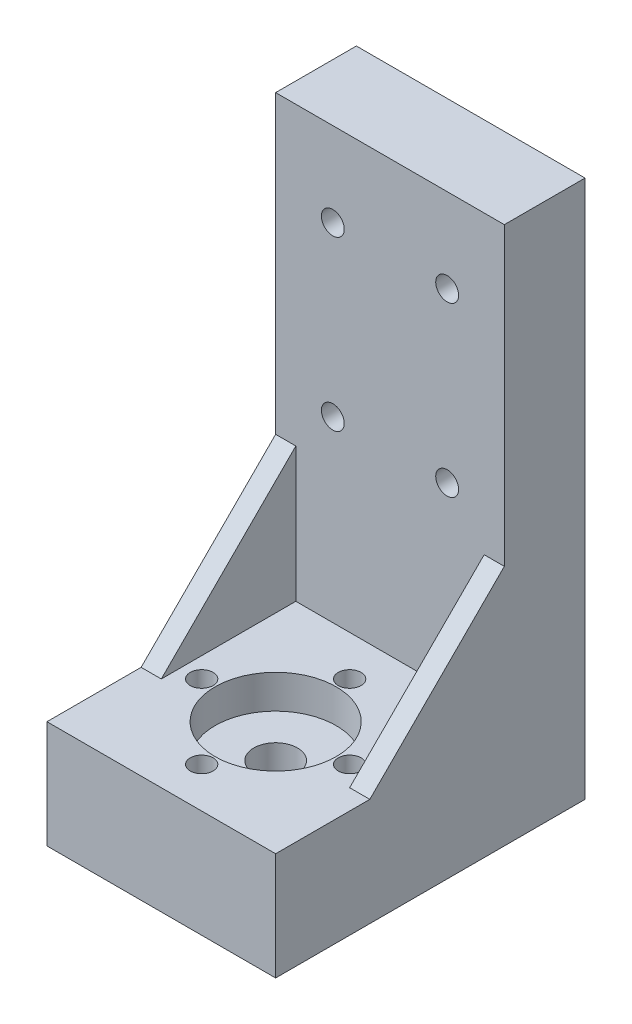
ISO-10303-21;
HEADER;
FILE_DESCRIPTION(('STEP AP214'),'2;1');
FILE_NAME('part.step','',(''),(''),'','','');
FILE_SCHEMA(('AUTOMOTIVE_DESIGN { 1 0 10303 214 1 1 1 1 }'));
ENDSEC;
DATA;
#1=APPLICATION_CONTEXT('core data for automotive mechanical design processes');
#2=APPLICATION_PROTOCOL_DEFINITION('international standard','automotive_design',2000,#1);
#3=PRODUCT_CONTEXT('',#1,'mechanical');
#4=PRODUCT('Part','Part','',(#3));
#5=PRODUCT_RELATED_PRODUCT_CATEGORY('part','',(#4));
#6=PRODUCT_DEFINITION_FORMATION('','',#4);
#7=PRODUCT_DEFINITION_CONTEXT('part definition',#1,'design');
#8=PRODUCT_DEFINITION('design','',#6,#7);
#9=PRODUCT_DEFINITION_SHAPE('','',#8);
#10=(LENGTH_UNIT() NAMED_UNIT(*) SI_UNIT(.MILLI.,.METRE.));
#11=(NAMED_UNIT(*) PLANE_ANGLE_UNIT() SI_UNIT($,.RADIAN.));
#12=(NAMED_UNIT(*) SI_UNIT($,.STERADIAN.) SOLID_ANGLE_UNIT());
#13=UNCERTAINTY_MEASURE_WITH_UNIT(LENGTH_MEASURE(1.E-05),#10,'distance_accuracy_value','');
#14=(GEOMETRIC_REPRESENTATION_CONTEXT(3) GLOBAL_UNCERTAINTY_ASSIGNED_CONTEXT((#13)) GLOBAL_UNIT_ASSIGNED_CONTEXT((#10,
#11,#12)) REPRESENTATION_CONTEXT('',''));
#15=CARTESIAN_POINT('',(0.,0.,0.));
#16=DIRECTION('',(0.,0.,1.));
#17=DIRECTION('',(1.,0.,0.));
#18=AXIS2_PLACEMENT_3D('',#15,#16,#17);
#19=CARTESIAN_POINT('',(0.,16.,0.));
#20=DIRECTION('',(0.,1.,0.));
#21=DIRECTION('',(0.,0.,1.));
#22=AXIS2_PLACEMENT_3D('',#19,#20,#21);
#23=PLANE('',#22);
#24=CARTESIAN_POINT('',(0.,16.,0.));
#25=DIRECTION('',(0.,1.,0.));
#26=DIRECTION('',(0.,0.,1.));
#27=AXIS2_PLACEMENT_3D('',#24,#25,#26);
#28=CIRCLE('',#27,9.);
#29=CARTESIAN_POINT('',(0.,16.,9.));
#30=VERTEX_POINT('',#29);
#31=EDGE_CURVE('E1535',#30,#30,#28,.T.);
#32=ORIENTED_EDGE('',*,*,#31,.F.);
#33=EDGE_LOOP('',(#32));
#34=FACE_BOUND('',#33,.T.);
#35=CARTESIAN_POINT('',(0.,16.,-11.));
#36=DIRECTION('',(0.,1.,0.));
#37=DIRECTION('',(0.,0.,1.));
#38=AXIS2_PLACEMENT_3D('',#35,#36,#37);
#39=CIRCLE('',#38,1.7);
#40=CARTESIAN_POINT('',(0.,16.,-9.3));
#41=VERTEX_POINT('',#40);
#42=EDGE_CURVE('E1558',#41,#41,#39,.T.);
#43=ORIENTED_EDGE('',*,*,#42,.F.);
#44=EDGE_LOOP('',(#43));
#45=FACE_BOUND('',#44,.T.);
#46=CARTESIAN_POINT('',(11.,16.,0.));
#47=DIRECTION('',(0.,1.,0.));
#48=DIRECTION('',(0.,0.,1.));
#49=AXIS2_PLACEMENT_3D('',#46,#47,#48);
#50=CIRCLE('',#49,1.7);
#51=CARTESIAN_POINT('',(11.,16.,1.70000000000004));
#52=VERTEX_POINT('',#51);
#53=EDGE_CURVE('E1570',#52,#52,#50,.T.);
#54=ORIENTED_EDGE('',*,*,#53,.F.);
#55=EDGE_LOOP('',(#54));
#56=FACE_BOUND('',#55,.T.);
#57=CARTESIAN_POINT('',(0.,16.,11.));
#58=DIRECTION('',(0.,1.,0.));
#59=DIRECTION('',(0.,0.,1.));
#60=AXIS2_PLACEMENT_3D('',#57,#58,#59);
#61=CIRCLE('',#60,1.7);
#62=CARTESIAN_POINT('',(0.,16.,12.7));
#63=VERTEX_POINT('',#62);
#64=EDGE_CURVE('E1543',#63,#63,#61,.T.);
#65=ORIENTED_EDGE('',*,*,#64,.F.);
#66=EDGE_LOOP('',(#65));
#67=FACE_BOUND('',#66,.T.);
#68=CARTESIAN_POINT('',(-11.,16.,-1.15218884181823E-13));
#69=DIRECTION('',(0.,1.,0.));
#70=DIRECTION('',(0.,0.,1.));
#71=AXIS2_PLACEMENT_3D('',#68,#69,#70);
#72=CIRCLE('',#71,1.7);
#73=CARTESIAN_POINT('',(-11.,16.,1.69999999999988));
#74=VERTEX_POINT('',#73);
#75=EDGE_CURVE('E1555',#74,#74,#72,.T.);
#76=ORIENTED_EDGE('',*,*,#75,.F.);
#77=EDGE_LOOP('',(#76));
#78=FACE_BOUND('',#77,.T.);
#79=DIRECTION('',(-1.,0.,0.));
#80=VECTOR('',#79,1.);
#81=CARTESIAN_POINT('',(17.,16.,-17.));
#82=LINE('',#81,#80);
#83=CARTESIAN_POINT('',(14.,16.,-17.));
#84=VERTEX_POINT('',#83);
#85=CARTESIAN_POINT('',(-14.,16.,-17.));
#86=VERTEX_POINT('',#85);
#87=EDGE_CURVE('E1472',#84,#86,#82,.T.);
#88=ORIENTED_EDGE('',*,*,#87,.T.);
#89=DIRECTION('',(0.,0.,1.));
#90=VECTOR('',#89,1.);
#91=CARTESIAN_POINT('',(-14.,16.,-17.));
#92=LINE('',#91,#90);
#93=CARTESIAN_POINT('',(-14.,16.,3.));
#94=VERTEX_POINT('',#93);
#95=EDGE_CURVE('E1468',#86,#94,#92,.T.);
#96=ORIENTED_EDGE('',*,*,#95,.T.);
#97=DIRECTION('',(-1.,0.,0.));
#98=VECTOR('',#97,1.);
#99=CARTESIAN_POINT('',(-14.,16.,3.));
#100=LINE('',#99,#98);
#101=CARTESIAN_POINT('',(-17.,16.,2.99999999999999));
#102=VERTEX_POINT('',#101);
#103=EDGE_CURVE('E1452',#94,#102,#100,.T.);
#104=ORIENTED_EDGE('',*,*,#103,.T.);
#105=DIRECTION('',(0.,0.,1.));
#106=VECTOR('',#105,1.);
#107=CARTESIAN_POINT('',(-17.,16.,17.));
#108=LINE('',#107,#106);
#109=CARTESIAN_POINT('',(-17.,16.,17.));
#110=VERTEX_POINT('',#109);
#111=EDGE_CURVE('E1615',#102,#110,#108,.T.);
#112=ORIENTED_EDGE('',*,*,#111,.T.);
#113=DIRECTION('',(1.,0.,0.));
#114=VECTOR('',#113,1.);
#115=CARTESIAN_POINT('',(17.,16.,17.));
#116=LINE('',#115,#114);
#117=CARTESIAN_POINT('',(17.,16.,17.));
#118=VERTEX_POINT('',#117);
#119=EDGE_CURVE('E1614',#110,#118,#116,.T.);
#120=ORIENTED_EDGE('',*,*,#119,.T.);
#121=DIRECTION('',(0.,0.,-1.));
#122=VECTOR('',#121,1.);
#123=CARTESIAN_POINT('',(17.,16.,17.));
#124=LINE('',#123,#122);
#125=CARTESIAN_POINT('',(17.,16.,3.));
#126=VERTEX_POINT('',#125);
#127=EDGE_CURVE('E1616',#118,#126,#124,.T.);
#128=ORIENTED_EDGE('',*,*,#127,.T.);
#129=DIRECTION('',(1.,0.,0.));
#130=VECTOR('',#129,1.);
#131=CARTESIAN_POINT('',(14.,16.,3.));
#132=LINE('',#131,#130);
#133=CARTESIAN_POINT('',(14.,16.,3.));
#134=VERTEX_POINT('',#133);
#135=EDGE_CURVE('E1499',#134,#126,#132,.T.);
#136=ORIENTED_EDGE('',*,*,#135,.F.);
#137=DIRECTION('',(0.,0.,-1.));
#138=VECTOR('',#137,1.);
#139=CARTESIAN_POINT('',(14.,16.,-17.));
#140=LINE('',#139,#138);
#141=EDGE_CURVE('E1495',#134,#84,#140,.T.);
#142=ORIENTED_EDGE('',*,*,#141,.T.);
#143=EDGE_LOOP('',(#88,#96,#104,#112,#120,#128,#136,#142));
#144=FACE_BOUND('',#143,.T.);
#145=ADVANCED_FACE('F1377',(#34,#45,#56,#67,#78,#144),#23,.T.);
#146=CARTESIAN_POINT('',(0.,0.,-17.));
#147=DIRECTION('',(0.,0.,1.));
#148=DIRECTION('',(1.,0.,0.));
#149=AXIS2_PLACEMENT_3D('',#146,#147,#148);
#150=PLANE('',#149);
#151=DIRECTION('',(-1.,0.,0.));
#152=VECTOR('',#151,1.);
#153=CARTESIAN_POINT('',(-14.,36.,-17.));
#154=LINE('',#153,#152);
#155=CARTESIAN_POINT('',(-14.,36.,-17.));
#156=VERTEX_POINT('',#155);
#157=CARTESIAN_POINT('',(-17.,36.,-17.));
#158=VERTEX_POINT('',#157);
#159=EDGE_CURVE('E1463',#156,#158,#154,.T.);
#160=ORIENTED_EDGE('',*,*,#159,.F.);
#161=DIRECTION('',(0.,-1.,0.));
#162=VECTOR('',#161,1.);
#163=CARTESIAN_POINT('',(-14.,16.,-17.));
#164=LINE('',#163,#162);
#165=EDGE_CURVE('E1462',#156,#86,#164,.T.);
#166=ORIENTED_EDGE('',*,*,#165,.T.);
#167=ORIENTED_EDGE('',*,*,#87,.F.);
#168=DIRECTION('',(0.,1.,0.));
#169=VECTOR('',#168,1.);
#170=CARTESIAN_POINT('',(14.,16.,-17.));
#171=LINE('',#170,#169);
#172=CARTESIAN_POINT('',(14.,36.,-17.));
#173=VERTEX_POINT('',#172);
#174=EDGE_CURVE('E1484',#84,#173,#171,.T.);
#175=ORIENTED_EDGE('',*,*,#174,.T.);
#176=DIRECTION('',(1.,0.,0.));
#177=VECTOR('',#176,1.);
#178=CARTESIAN_POINT('',(14.,36.,-17.));
#179=LINE('',#178,#177);
#180=CARTESIAN_POINT('',(17.,36.,-17.));
#181=VERTEX_POINT('',#180);
#182=EDGE_CURVE('E1493',#173,#181,#179,.T.);
#183=ORIENTED_EDGE('',*,*,#182,.T.);
#184=DIRECTION('',(0.,-1.,0.));
#185=VECTOR('',#184,1.);
#186=CARTESIAN_POINT('',(17.,0.,-17.));
#187=LINE('',#186,#185);
#188=CARTESIAN_POINT('',(17.,80.,-17.));
#189=VERTEX_POINT('',#188);
#190=EDGE_CURVE('E1576',#189,#181,#187,.T.);
#191=ORIENTED_EDGE('',*,*,#190,.F.);
#192=DIRECTION('',(1.,0.,0.));
#193=VECTOR('',#192,1.);
#194=CARTESIAN_POINT('',(17.,80.,-17.));
#195=LINE('',#194,#193);
#196=CARTESIAN_POINT('',(-17.,80.,-17.));
#197=VERTEX_POINT('',#196);
#198=EDGE_CURVE('E1585',#197,#189,#195,.T.);
#199=ORIENTED_EDGE('',*,*,#198,.F.);
#200=DIRECTION('',(0.,1.,0.));
#201=VECTOR('',#200,1.);
#202=CARTESIAN_POINT('',(-17.,0.,-17.));
#203=LINE('',#202,#201);
#204=EDGE_CURVE('E1599',#158,#197,#203,.T.);
#205=ORIENTED_EDGE('',*,*,#204,.F.);
#206=EDGE_LOOP('',(#160,#166,#167,#175,#183,#191,#199,#205));
#207=FACE_BOUND('',#206,.T.);
#208=CARTESIAN_POINT('',(-8.49999999999999,42.5,-17.));
#209=DIRECTION('',(0.,0.,1.));
#210=DIRECTION('',(1.,0.,0.));
#211=AXIS2_PLACEMENT_3D('',#208,#209,#210);
#212=CIRCLE('',#211,1.7);
#213=CARTESIAN_POINT('',(-6.79999999999999,42.5,-17.));
#214=VERTEX_POINT('',#213);
#215=EDGE_CURVE('E1521',#214,#214,#212,.T.);
#216=ORIENTED_EDGE('',*,*,#215,.F.);
#217=EDGE_LOOP('',(#216));
#218=FACE_BOUND('',#217,.T.);
#219=CARTESIAN_POINT('',(8.50000000000001,42.5,-17.));
#220=DIRECTION('',(0.,0.,1.));
#221=DIRECTION('',(1.,0.,0.));
#222=AXIS2_PLACEMENT_3D('',#219,#220,#221);
#223=CIRCLE('',#222,1.7);
#224=CARTESIAN_POINT('',(10.2,42.5,-17.));
#225=VERTEX_POINT('',#224);
#226=EDGE_CURVE('E1514',#225,#225,#223,.T.);
#227=ORIENTED_EDGE('',*,*,#226,.F.);
#228=EDGE_LOOP('',(#227));
#229=FACE_BOUND('',#228,.T.);
#230=CARTESIAN_POINT('',(8.50000000000001,67.5,-17.));
#231=DIRECTION('',(0.,0.,1.));
#232=DIRECTION('',(1.,0.,0.));
#233=AXIS2_PLACEMENT_3D('',#230,#231,#232);
#234=CIRCLE('',#233,1.7);
#235=CARTESIAN_POINT('',(10.2,67.5,-17.));
#236=VERTEX_POINT('',#235);
#237=EDGE_CURVE('E1505',#236,#236,#234,.T.);
#238=ORIENTED_EDGE('',*,*,#237,.F.);
#239=EDGE_LOOP('',(#238));
#240=FACE_BOUND('',#239,.T.);
#241=CARTESIAN_POINT('',(-8.49999999999999,67.5,-17.));
#242=DIRECTION('',(0.,0.,1.));
#243=DIRECTION('',(1.,0.,0.));
#244=AXIS2_PLACEMENT_3D('',#241,#242,#243);
#245=CIRCLE('',#244,1.70000000000001);
#246=CARTESIAN_POINT('',(-6.79999999999999,67.5,-17.));
#247=VERTEX_POINT('',#246);
#248=EDGE_CURVE('E1506',#247,#247,#245,.T.);
#249=ORIENTED_EDGE('',*,*,#248,.F.);
#250=EDGE_LOOP('',(#249));
#251=FACE_BOUND('',#250,.T.);
#252=ADVANCED_FACE('F1658',(#207,#218,#229,#240,#251),#150,.T.);
#253=CARTESIAN_POINT('',(0.,0.,0.));
#254=DIRECTION('',(0.,1.,0.));
#255=DIRECTION('',(0.,0.,1.));
#256=AXIS2_PLACEMENT_3D('',#253,#254,#255);
#257=CYLINDRICAL_SURFACE('',#256,3.25);
#258=CARTESIAN_POINT('',(0.,0.,0.));
#259=DIRECTION('',(0.,1.,0.));
#260=DIRECTION('',(0.,0.,1.));
#261=AXIS2_PLACEMENT_3D('',#258,#259,#260);
#262=CIRCLE('',#261,3.25);
#263=CARTESIAN_POINT('',(0.,0.,3.25));
#264=VERTEX_POINT('',#263);
#265=EDGE_CURVE('E1563',#264,#264,#262,.T.);
#266=ORIENTED_EDGE('',*,*,#265,.F.);
#267=EDGE_LOOP('',(#266));
#268=FACE_BOUND('',#267,.T.);
#269=CARTESIAN_POINT('',(0.,11.,0.));
#270=DIRECTION('',(0.,1.,0.));
#271=DIRECTION('',(0.,0.,1.));
#272=AXIS2_PLACEMENT_3D('',#269,#270,#271);
#273=CIRCLE('',#272,3.25);
#274=CARTESIAN_POINT('',(0.,11.,3.25));
#275=VERTEX_POINT('',#274);
#276=EDGE_CURVE('E1378',#275,#275,#273,.F.);
#277=ORIENTED_EDGE('',*,*,#276,.F.);
#278=EDGE_LOOP('',(#277));
#279=FACE_BOUND('',#278,.T.);
#280=ADVANCED_FACE('F1688',(#268,#279),#257,.F.);
#281=CARTESIAN_POINT('',(-17.,16.,17.));
#282=DIRECTION('',(1.,0.,0.));
#283=DIRECTION('',(0.,0.,-1.));
#284=AXIS2_PLACEMENT_3D('',#281,#282,#283);
#285=PLANE('',#284);
#286=DIRECTION('',(0.,0.707106781186548,-0.707106781186547));
#287=VECTOR('',#286,1.);
#288=CARTESIAN_POINT('',(-17.,16.,3.));
#289=LINE('',#288,#287);
#290=EDGE_CURVE('E1392',#102,#158,#289,.T.);
#291=ORIENTED_EDGE('',*,*,#290,.T.);
#292=ORIENTED_EDGE('',*,*,#204,.T.);
#293=DIRECTION('',(0.,0.,1.));
#294=VECTOR('',#293,1.);
#295=CARTESIAN_POINT('',(-17.,80.,-29.));
#296=LINE('',#295,#294);
#297=CARTESIAN_POINT('',(-17.,80.,-29.));
#298=VERTEX_POINT('',#297);
#299=EDGE_CURVE('E1610',#298,#197,#296,.T.);
#300=ORIENTED_EDGE('',*,*,#299,.F.);
#301=DIRECTION('',(0.,1.,0.));
#302=VECTOR('',#301,1.);
#303=CARTESIAN_POINT('',(-17.,0.,-29.));
#304=LINE('',#303,#302);
#305=CARTESIAN_POINT('',(-17.,0.,-29.));
#306=VERTEX_POINT('',#305);
#307=EDGE_CURVE('E1588',#306,#298,#304,.T.);
#308=ORIENTED_EDGE('',*,*,#307,.F.);
#309=DIRECTION('',(0.,0.,1.));
#310=VECTOR('',#309,1.);
#311=CARTESIAN_POINT('',(-17.,0.,17.));
#312=LINE('',#311,#310);
#313=CARTESIAN_POINT('',(-17.,0.,17.));
#314=VERTEX_POINT('',#313);
#315=EDGE_CURVE('E1611',#306,#314,#312,.T.);
#316=ORIENTED_EDGE('',*,*,#315,.T.);
#317=DIRECTION('',(0.,-1.,0.));
#318=VECTOR('',#317,1.);
#319=CARTESIAN_POINT('',(-17.,16.,17.));
#320=LINE('',#319,#318);
#321=EDGE_CURVE('E14',#110,#314,#320,.T.);
#322=ORIENTED_EDGE('',*,*,#321,.F.);
#323=ORIENTED_EDGE('',*,*,#111,.F.);
#324=EDGE_LOOP('',(#291,#292,#300,#308,#316,#322,#323));
#325=FACE_BOUND('',#324,.T.);
#326=ADVANCED_FACE('F1376',(#325),#285,.F.);
#327=CARTESIAN_POINT('',(17.,16.,17.));
#328=DIRECTION('',(0.,0.,-1.));
#329=DIRECTION('',(-1.,0.,0.));
#330=AXIS2_PLACEMENT_3D('',#327,#328,#329);
#331=PLANE('',#330);
#332=DIRECTION('',(1.,0.,0.));
#333=VECTOR('',#332,1.);
#334=CARTESIAN_POINT('',(17.,0.,17.));
#335=LINE('',#334,#333);
#336=CARTESIAN_POINT('',(17.,0.,17.));
#337=VERTEX_POINT('',#336);
#338=EDGE_CURVE('E1629',#314,#337,#335,.T.);
#339=ORIENTED_EDGE('',*,*,#338,.T.);
#340=DIRECTION('',(0.,-1.,0.));
#341=VECTOR('',#340,1.);
#342=CARTESIAN_POINT('',(17.,16.,17.));
#343=LINE('',#342,#341);
#344=EDGE_CURVE('E1386',#118,#337,#343,.T.);
#345=ORIENTED_EDGE('',*,*,#344,.F.);
#346=ORIENTED_EDGE('',*,*,#119,.F.);
#347=ORIENTED_EDGE('',*,*,#321,.T.);
#348=EDGE_LOOP('',(#339,#345,#346,#347));
#349=FACE_BOUND('',#348,.T.);
#350=ADVANCED_FACE('F1666',(#349),#331,.F.);
#351=CARTESIAN_POINT('',(17.,16.,17.));
#352=DIRECTION('',(-1.,0.,0.));
#353=DIRECTION('',(0.,0.,1.));
#354=AXIS2_PLACEMENT_3D('',#351,#352,#353);
#355=PLANE('',#354);
#356=ORIENTED_EDGE('',*,*,#190,.T.);
#357=DIRECTION('',(0.,-0.707106781186548,0.707106781186547));
#358=VECTOR('',#357,1.);
#359=CARTESIAN_POINT('',(17.,36.,-17.));
#360=LINE('',#359,#358);
#361=EDGE_CURVE('E1403',#181,#126,#360,.T.);
#362=ORIENTED_EDGE('',*,*,#361,.T.);
#363=ORIENTED_EDGE('',*,*,#127,.F.);
#364=ORIENTED_EDGE('',*,*,#344,.T.);
#365=DIRECTION('',(0.,0.,-1.));
#366=VECTOR('',#365,1.);
#367=CARTESIAN_POINT('',(17.,0.,17.));
#368=LINE('',#367,#366);
#369=CARTESIAN_POINT('',(17.,0.,-29.));
#370=VERTEX_POINT('',#369);
#371=EDGE_CURVE('E1617',#337,#370,#368,.T.);
#372=ORIENTED_EDGE('',*,*,#371,.T.);
#373=DIRECTION('',(0.,-1.,0.));
#374=VECTOR('',#373,1.);
#375=CARTESIAN_POINT('',(17.,0.,-29.));
#376=LINE('',#375,#374);
#377=CARTESIAN_POINT('',(17.,80.,-29.));
#378=VERTEX_POINT('',#377);
#379=EDGE_CURVE('E1578',#378,#370,#376,.T.);
#380=ORIENTED_EDGE('',*,*,#379,.F.);
#381=DIRECTION('',(0.,0.,1.));
#382=VECTOR('',#381,1.);
#383=CARTESIAN_POINT('',(17.,80.,-29.));
#384=LINE('',#383,#382);
#385=EDGE_CURVE('E1594',#378,#189,#384,.T.);
#386=ORIENTED_EDGE('',*,*,#385,.T.);
#387=EDGE_LOOP('',(#356,#362,#363,#364,#372,#380,#386));
#388=FACE_BOUND('',#387,.T.);
#389=ADVANCED_FACE('F1638',(#388),#355,.F.);
#390=CARTESIAN_POINT('',(0.,0.,0.));
#391=DIRECTION('',(0.,1.,0.));
#392=DIRECTION('',(0.,0.,1.));
#393=AXIS2_PLACEMENT_3D('',#390,#391,#392);
#394=PLANE('',#393);
#395=CARTESIAN_POINT('',(0.,0.,-11.));
#396=DIRECTION('',(0.,1.,0.));
#397=DIRECTION('',(0.,0.,1.));
#398=AXIS2_PLACEMENT_3D('',#395,#396,#397);
#399=CIRCLE('',#398,1.7);
#400=CARTESIAN_POINT('',(0.,0.,-9.3));
#401=VERTEX_POINT('',#400);
#402=EDGE_CURVE('E1565',#401,#401,#399,.T.);
#403=ORIENTED_EDGE('',*,*,#402,.T.);
#404=EDGE_LOOP('',(#403));
#405=FACE_BOUND('',#404,.T.);
#406=CARTESIAN_POINT('',(11.,0.,0.));
#407=DIRECTION('',(0.,1.,0.));
#408=DIRECTION('',(0.,0.,1.));
#409=AXIS2_PLACEMENT_3D('',#406,#407,#408);
#410=CIRCLE('',#409,1.7);
#411=CARTESIAN_POINT('',(11.,0.,1.70000000000004));
#412=VERTEX_POINT('',#411);
#413=EDGE_CURVE('E1550',#412,#412,#410,.T.);
#414=ORIENTED_EDGE('',*,*,#413,.T.);
#415=EDGE_LOOP('',(#414));
#416=FACE_BOUND('',#415,.T.);
#417=CARTESIAN_POINT('',(0.,0.,11.));
#418=DIRECTION('',(0.,1.,0.));
#419=DIRECTION('',(0.,0.,1.));
#420=AXIS2_PLACEMENT_3D('',#417,#418,#419);
#421=CIRCLE('',#420,1.7);
#422=CARTESIAN_POINT('',(0.,0.,12.7));
#423=VERTEX_POINT('',#422);
#424=EDGE_CURVE('E1547',#423,#423,#421,.T.);
#425=ORIENTED_EDGE('',*,*,#424,.T.);
#426=EDGE_LOOP('',(#425));
#427=FACE_BOUND('',#426,.T.);
#428=CARTESIAN_POINT('',(-11.,0.,-1.15218884181823E-13));
#429=DIRECTION('',(0.,1.,0.));
#430=DIRECTION('',(0.,0.,1.));
#431=AXIS2_PLACEMENT_3D('',#428,#429,#430);
#432=CIRCLE('',#431,1.7);
#433=CARTESIAN_POINT('',(-11.,0.,1.69999999999988));
#434=VERTEX_POINT('',#433);
#435=EDGE_CURVE('E1557',#434,#434,#432,.T.);
#436=ORIENTED_EDGE('',*,*,#435,.T.);
#437=EDGE_LOOP('',(#436));
#438=FACE_BOUND('',#437,.T.);
#439=ORIENTED_EDGE('',*,*,#265,.T.);
#440=EDGE_LOOP('',(#439));
#441=FACE_BOUND('',#440,.T.);
#442=ORIENTED_EDGE('',*,*,#315,.F.);
#443=DIRECTION('',(-1.,0.,0.));
#444=VECTOR('',#443,1.);
#445=CARTESIAN_POINT('',(17.,0.,-29.));
#446=LINE('',#445,#444);
#447=EDGE_CURVE('E1583',#370,#306,#446,.T.);
#448=ORIENTED_EDGE('',*,*,#447,.F.);
#449=ORIENTED_EDGE('',*,*,#371,.F.);
#450=ORIENTED_EDGE('',*,*,#338,.F.);
#451=EDGE_LOOP('',(#442,#448,#449,#450));
#452=FACE_BOUND('',#451,.T.);
#453=ADVANCED_FACE('F1646',(#405,#416,#427,#438,#441,#452),#394,.F.);
#454=CARTESIAN_POINT('',(17.,80.,-29.));
#455=DIRECTION('',(0.,-1.,0.));
#456=DIRECTION('',(0.,0.,-1.));
#457=AXIS2_PLACEMENT_3D('',#454,#455,#456);
#458=PLANE('',#457);
#459=ORIENTED_EDGE('',*,*,#198,.T.);
#460=ORIENTED_EDGE('',*,*,#385,.F.);
#461=DIRECTION('',(1.,0.,0.));
#462=VECTOR('',#461,1.);
#463=CARTESIAN_POINT('',(17.,80.,-29.));
#464=LINE('',#463,#462);
#465=EDGE_CURVE('E1592',#298,#378,#464,.T.);
#466=ORIENTED_EDGE('',*,*,#465,.F.);
#467=ORIENTED_EDGE('',*,*,#299,.T.);
#468=EDGE_LOOP('',(#459,#460,#466,#467));
#469=FACE_BOUND('',#468,.T.);
#470=ADVANCED_FACE('F1667',(#469),#458,.F.);
#471=CARTESIAN_POINT('',(0.,0.,-29.));
#472=DIRECTION('',(0.,0.,1.));
#473=DIRECTION('',(1.,0.,0.));
#474=AXIS2_PLACEMENT_3D('',#471,#472,#473);
#475=PLANE('',#474);
#476=CARTESIAN_POINT('',(-8.49999999999999,42.5,-29.));
#477=DIRECTION('',(0.,0.,1.));
#478=DIRECTION('',(1.,0.,0.));
#479=AXIS2_PLACEMENT_3D('',#476,#477,#478);
#480=CIRCLE('',#479,1.7);
#481=CARTESIAN_POINT('',(-6.79999999999999,42.5,-29.));
#482=VERTEX_POINT('',#481);
#483=EDGE_CURVE('E1503',#482,#482,#480,.T.);
#484=ORIENTED_EDGE('',*,*,#483,.T.);
#485=EDGE_LOOP('',(#484));
#486=FACE_BOUND('',#485,.T.);
#487=CARTESIAN_POINT('',(8.50000000000001,42.5,-29.));
#488=DIRECTION('',(0.,0.,1.));
#489=DIRECTION('',(1.,0.,0.));
#490=AXIS2_PLACEMENT_3D('',#487,#488,#489);
#491=CIRCLE('',#490,1.7);
#492=CARTESIAN_POINT('',(10.2,42.5,-29.));
#493=VERTEX_POINT('',#492);
#494=EDGE_CURVE('E1517',#493,#493,#491,.T.);
#495=ORIENTED_EDGE('',*,*,#494,.T.);
#496=EDGE_LOOP('',(#495));
#497=FACE_BOUND('',#496,.T.);
#498=CARTESIAN_POINT('',(8.50000000000001,67.5,-29.));
#499=DIRECTION('',(0.,0.,1.));
#500=DIRECTION('',(1.,0.,0.));
#501=AXIS2_PLACEMENT_3D('',#498,#499,#500);
#502=CIRCLE('',#501,1.7);
#503=CARTESIAN_POINT('',(10.2,67.5,-29.));
#504=VERTEX_POINT('',#503);
#505=EDGE_CURVE('E1509',#504,#504,#502,.T.);
#506=ORIENTED_EDGE('',*,*,#505,.T.);
#507=EDGE_LOOP('',(#506));
#508=FACE_BOUND('',#507,.T.);
#509=CARTESIAN_POINT('',(-8.49999999999999,67.5,-29.));
#510=DIRECTION('',(0.,0.,1.));
#511=DIRECTION('',(1.,0.,0.));
#512=AXIS2_PLACEMENT_3D('',#509,#510,#511);
#513=CIRCLE('',#512,1.70000000000001);
#514=CARTESIAN_POINT('',(-6.79999999999999,67.5,-29.));
#515=VERTEX_POINT('',#514);
#516=EDGE_CURVE('E1526',#515,#515,#513,.T.);
#517=ORIENTED_EDGE('',*,*,#516,.T.);
#518=EDGE_LOOP('',(#517));
#519=FACE_BOUND('',#518,.T.);
#520=ORIENTED_EDGE('',*,*,#379,.T.);
#521=ORIENTED_EDGE('',*,*,#447,.T.);
#522=ORIENTED_EDGE('',*,*,#307,.T.);
#523=ORIENTED_EDGE('',*,*,#465,.T.);
#524=EDGE_LOOP('',(#520,#521,#522,#523));
#525=FACE_BOUND('',#524,.T.);
#526=ADVANCED_FACE('F1648',(#486,#497,#508,#519,#525),#475,.F.);
#527=CARTESIAN_POINT('',(-11.,0.,-1.15218884181823E-13));
#528=DIRECTION('',(0.,1.,0.));
#529=DIRECTION('',(0.,0.,1.));
#530=AXIS2_PLACEMENT_3D('',#527,#528,#529);
#531=CYLINDRICAL_SURFACE('',#530,1.7);
#532=ORIENTED_EDGE('',*,*,#435,.F.);
#533=EDGE_LOOP('',(#532));
#534=FACE_BOUND('',#533,.T.);
#535=ORIENTED_EDGE('',*,*,#75,.T.);
#536=EDGE_LOOP('',(#535));
#537=FACE_BOUND('',#536,.T.);
#538=ADVANCED_FACE('F1680',(#534,#537),#531,.F.);
#539=CARTESIAN_POINT('',(0.,0.,11.));
#540=DIRECTION('',(0.,1.,0.));
#541=DIRECTION('',(0.,0.,1.));
#542=AXIS2_PLACEMENT_3D('',#539,#540,#541);
#543=CYLINDRICAL_SURFACE('',#542,1.7);
#544=ORIENTED_EDGE('',*,*,#424,.F.);
#545=EDGE_LOOP('',(#544));
#546=FACE_BOUND('',#545,.T.);
#547=ORIENTED_EDGE('',*,*,#64,.T.);
#548=EDGE_LOOP('',(#547));
#549=FACE_BOUND('',#548,.T.);
#550=ADVANCED_FACE('F1715',(#546,#549),#543,.F.);
#551=CARTESIAN_POINT('',(11.,0.,0.));
#552=DIRECTION('',(0.,1.,0.));
#553=DIRECTION('',(0.,0.,1.));
#554=AXIS2_PLACEMENT_3D('',#551,#552,#553);
#555=CYLINDRICAL_SURFACE('',#554,1.7);
#556=ORIENTED_EDGE('',*,*,#413,.F.);
#557=EDGE_LOOP('',(#556));
#558=FACE_BOUND('',#557,.T.);
#559=ORIENTED_EDGE('',*,*,#53,.T.);
#560=EDGE_LOOP('',(#559));
#561=FACE_BOUND('',#560,.T.);
#562=ADVANCED_FACE('F1711',(#558,#561),#555,.F.);
#563=CARTESIAN_POINT('',(0.,0.,-11.));
#564=DIRECTION('',(0.,1.,0.));
#565=DIRECTION('',(0.,0.,1.));
#566=AXIS2_PLACEMENT_3D('',#563,#564,#565);
#567=CYLINDRICAL_SURFACE('',#566,1.7);
#568=ORIENTED_EDGE('',*,*,#402,.F.);
#569=EDGE_LOOP('',(#568));
#570=FACE_BOUND('',#569,.T.);
#571=ORIENTED_EDGE('',*,*,#42,.T.);
#572=EDGE_LOOP('',(#571));
#573=FACE_BOUND('',#572,.T.);
#574=ADVANCED_FACE('F1713',(#570,#573),#567,.F.);
#575=CARTESIAN_POINT('',(0.,11.,0.));
#576=DIRECTION('',(0.,1.,0.));
#577=DIRECTION('',(0.,0.,1.));
#578=AXIS2_PLACEMENT_3D('',#575,#576,#577);
#579=PLANE('',#578);
#580=CARTESIAN_POINT('',(0.,11.,0.));
#581=DIRECTION('',(0.,1.,0.));
#582=DIRECTION('',(0.,0.,1.));
#583=AXIS2_PLACEMENT_3D('',#580,#581,#582);
#584=CIRCLE('',#583,9.);
#585=CARTESIAN_POINT('',(0.,11.,9.));
#586=VERTEX_POINT('',#585);
#587=EDGE_CURVE('E1536',#586,#586,#584,.T.);
#588=ORIENTED_EDGE('',*,*,#587,.T.);
#589=EDGE_LOOP('',(#588));
#590=FACE_BOUND('',#589,.T.);
#591=ORIENTED_EDGE('',*,*,#276,.T.);
#592=EDGE_LOOP('',(#591));
#593=FACE_BOUND('',#592,.T.);
#594=ADVANCED_FACE('F1717',(#590,#593),#579,.T.);
#595=CARTESIAN_POINT('',(0.,11.,0.));
#596=DIRECTION('',(0.,1.,0.));
#597=DIRECTION('',(0.,0.,1.));
#598=AXIS2_PLACEMENT_3D('',#595,#596,#597);
#599=CYLINDRICAL_SURFACE('',#598,9.);
#600=ORIENTED_EDGE('',*,*,#587,.F.);
#601=EDGE_LOOP('',(#600));
#602=FACE_BOUND('',#601,.T.);
#603=ORIENTED_EDGE('',*,*,#31,.T.);
#604=EDGE_LOOP('',(#603));
#605=FACE_BOUND('',#604,.T.);
#606=ADVANCED_FACE('F1728',(#602,#605),#599,.F.);
#607=CARTESIAN_POINT('',(-8.49999999999999,67.5,-29.));
#608=DIRECTION('',(0.,0.,1.));
#609=DIRECTION('',(1.,0.,0.));
#610=AXIS2_PLACEMENT_3D('',#607,#608,#609);
#611=CYLINDRICAL_SURFACE('',#610,1.70000000000001);
#612=ORIENTED_EDGE('',*,*,#516,.F.);
#613=EDGE_LOOP('',(#612));
#614=FACE_BOUND('',#613,.T.);
#615=ORIENTED_EDGE('',*,*,#248,.T.);
#616=EDGE_LOOP('',(#615));
#617=FACE_BOUND('',#616,.T.);
#618=ADVANCED_FACE('F1729',(#614,#617),#611,.F.);
#619=CARTESIAN_POINT('',(8.50000000000001,67.5,-29.));
#620=DIRECTION('',(0.,0.,1.));
#621=DIRECTION('',(1.,0.,0.));
#622=AXIS2_PLACEMENT_3D('',#619,#620,#621);
#623=CYLINDRICAL_SURFACE('',#622,1.7);
#624=ORIENTED_EDGE('',*,*,#505,.F.);
#625=EDGE_LOOP('',(#624));
#626=FACE_BOUND('',#625,.T.);
#627=ORIENTED_EDGE('',*,*,#237,.T.);
#628=EDGE_LOOP('',(#627));
#629=FACE_BOUND('',#628,.T.);
#630=ADVANCED_FACE('F1734',(#626,#629),#623,.F.);
#631=CARTESIAN_POINT('',(8.50000000000001,42.5,-29.));
#632=DIRECTION('',(0.,0.,1.));
#633=DIRECTION('',(1.,0.,0.));
#634=AXIS2_PLACEMENT_3D('',#631,#632,#633);
#635=CYLINDRICAL_SURFACE('',#634,1.7);
#636=ORIENTED_EDGE('',*,*,#494,.F.);
#637=EDGE_LOOP('',(#636));
#638=FACE_BOUND('',#637,.T.);
#639=ORIENTED_EDGE('',*,*,#226,.T.);
#640=EDGE_LOOP('',(#639));
#641=FACE_BOUND('',#640,.T.);
#642=ADVANCED_FACE('F1739',(#638,#641),#635,.F.);
#643=CARTESIAN_POINT('',(-8.49999999999999,42.5,-29.));
#644=DIRECTION('',(0.,0.,1.));
#645=DIRECTION('',(1.,0.,0.));
#646=AXIS2_PLACEMENT_3D('',#643,#644,#645);
#647=CYLINDRICAL_SURFACE('',#646,1.7);
#648=ORIENTED_EDGE('',*,*,#483,.F.);
#649=EDGE_LOOP('',(#648));
#650=FACE_BOUND('',#649,.T.);
#651=ORIENTED_EDGE('',*,*,#215,.T.);
#652=EDGE_LOOP('',(#651));
#653=FACE_BOUND('',#652,.T.);
#654=ADVANCED_FACE('F1740',(#650,#653),#647,.F.);
#655=CARTESIAN_POINT('',(14.,36.,-17.));
#656=DIRECTION('',(0.,0.707106781186547,0.707106781186548));
#657=DIRECTION('',(0.,-0.707106781186548,0.707106781186547));
#658=AXIS2_PLACEMENT_3D('',#655,#656,#657);
#659=PLANE('',#658);
#660=ORIENTED_EDGE('',*,*,#361,.F.);
#661=ORIENTED_EDGE('',*,*,#182,.F.);
#662=DIRECTION('',(0.,-0.707106781186548,0.707106781186547));
#663=VECTOR('',#662,1.);
#664=CARTESIAN_POINT('',(14.,36.,-17.));
#665=LINE('',#664,#663);
#666=EDGE_CURVE('E1486',#173,#134,#665,.T.);
#667=ORIENTED_EDGE('',*,*,#666,.T.);
#668=ORIENTED_EDGE('',*,*,#135,.T.);
#669=EDGE_LOOP('',(#660,#661,#667,#668));
#670=FACE_BOUND('',#669,.T.);
#671=ADVANCED_FACE('F1659',(#670),#659,.T.);
#672=CARTESIAN_POINT('',(14.,0.,0.));
#673=DIRECTION('',(1.,0.,0.));
#674=DIRECTION('',(0.,0.,-1.));
#675=AXIS2_PLACEMENT_3D('',#672,#673,#674);
#676=PLANE('',#675);
#677=ORIENTED_EDGE('',*,*,#174,.F.);
#678=ORIENTED_EDGE('',*,*,#141,.F.);
#679=ORIENTED_EDGE('',*,*,#666,.F.);
#680=EDGE_LOOP('',(#677,#678,#679));
#681=FACE_BOUND('',#680,.T.);
#682=ADVANCED_FACE('F1661',(#681),#676,.F.);
#683=CARTESIAN_POINT('',(-14.,16.,3.));
#684=DIRECTION('',(0.,0.707106781186547,0.707106781186548));
#685=DIRECTION('',(0.,-0.707106781186548,0.707106781186547));
#686=AXIS2_PLACEMENT_3D('',#683,#684,#685);
#687=PLANE('',#686);
#688=ORIENTED_EDGE('',*,*,#290,.F.);
#689=ORIENTED_EDGE('',*,*,#103,.F.);
#690=DIRECTION('',(0.,0.707106781186548,-0.707106781186547));
#691=VECTOR('',#690,1.);
#692=CARTESIAN_POINT('',(-14.,16.,3.));
#693=LINE('',#692,#691);
#694=EDGE_CURVE('E1455',#94,#156,#693,.T.);
#695=ORIENTED_EDGE('',*,*,#694,.T.);
#696=ORIENTED_EDGE('',*,*,#159,.T.);
#697=EDGE_LOOP('',(#688,#689,#695,#696));
#698=FACE_BOUND('',#697,.T.);
#699=ADVANCED_FACE('F1453',(#698),#687,.T.);
#700=CARTESIAN_POINT('',(-14.,0.,0.));
#701=DIRECTION('',(-1.,0.,0.));
#702=DIRECTION('',(0.,0.,1.));
#703=AXIS2_PLACEMENT_3D('',#700,#701,#702);
#704=PLANE('',#703);
#705=ORIENTED_EDGE('',*,*,#95,.F.);
#706=ORIENTED_EDGE('',*,*,#165,.F.);
#707=ORIENTED_EDGE('',*,*,#694,.F.);
#708=EDGE_LOOP('',(#705,#706,#707));
#709=FACE_BOUND('',#708,.T.);
#710=ADVANCED_FACE('F1464',(#709),#704,.F.);
#711=CLOSED_SHELL('',(#145,#252,#280,#326,#350,#389,#453,#470,#526,#538,#550,#562,#574,#594,
#606,#618,#630,#642,#654,#671,#682,#699,#710));
#712=MANIFOLD_SOLID_BREP('B2',#711);
#713=ADVANCED_BREP_SHAPE_REPRESENTATION('',(#18,#712),#14);
#714=SHAPE_DEFINITION_REPRESENTATION(#9,#713);
ENDSEC;
END-ISO-10303-21;
